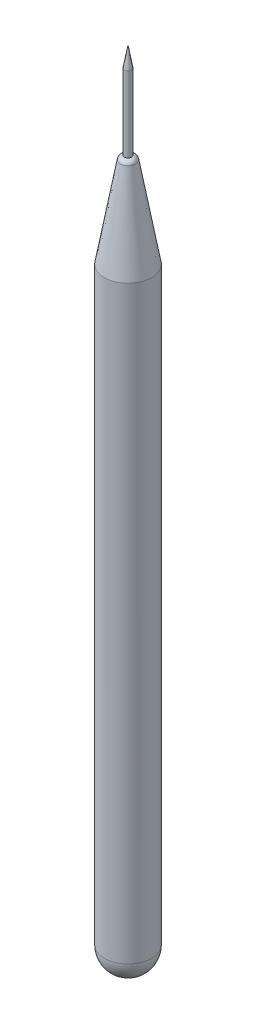
ISO-10303-21;
HEADER;
FILE_DESCRIPTION(('STEP AP214'),'2;1');
FILE_NAME('part.step','',(''),(''),'','','');
FILE_SCHEMA(('AUTOMOTIVE_DESIGN { 1 0 10303 214 1 1 1 1 }'));
ENDSEC;
DATA;
#1=APPLICATION_CONTEXT('core data for automotive mechanical design processes');
#2=APPLICATION_PROTOCOL_DEFINITION('international standard','automotive_design',2000,#1);
#3=PRODUCT_CONTEXT('',#1,'mechanical');
#4=PRODUCT('Part','Part','',(#3));
#5=PRODUCT_RELATED_PRODUCT_CATEGORY('part','',(#4));
#6=PRODUCT_DEFINITION_FORMATION('','',#4);
#7=PRODUCT_DEFINITION_CONTEXT('part definition',#1,'design');
#8=PRODUCT_DEFINITION('design','',#6,#7);
#9=PRODUCT_DEFINITION_SHAPE('','',#8);
#10=(LENGTH_UNIT() NAMED_UNIT(*) SI_UNIT(.MILLI.,.METRE.));
#11=(NAMED_UNIT(*) PLANE_ANGLE_UNIT() SI_UNIT($,.RADIAN.));
#12=(NAMED_UNIT(*) SI_UNIT($,.STERADIAN.) SOLID_ANGLE_UNIT());
#13=UNCERTAINTY_MEASURE_WITH_UNIT(LENGTH_MEASURE(1.E-05),#10,'distance_accuracy_value','');
#14=(GEOMETRIC_REPRESENTATION_CONTEXT(3) GLOBAL_UNCERTAINTY_ASSIGNED_CONTEXT((#13)) GLOBAL_UNIT_ASSIGNED_CONTEXT((#10,
#11,#12)) REPRESENTATION_CONTEXT('',''));
#15=CARTESIAN_POINT('',(0.,0.,0.));
#16=DIRECTION('',(0.,0.,1.));
#17=DIRECTION('',(1.,0.,0.));
#18=AXIS2_PLACEMENT_3D('',#15,#16,#17);
#19=CARTESIAN_POINT('',(0.,75.,0.));
#20=DIRECTION('',(0.,-1.,0.));
#21=DIRECTION('',(0.,0.,-1.));
#22=AXIS2_PLACEMENT_3D('',#19,#20,#21);
#23=CYLINDRICAL_SURFACE('',#22,5.);
#24=CARTESIAN_POINT('',(0.,-70.,0.));
#25=DIRECTION('',(0.,-1.,0.));
#26=DIRECTION('',(0.,0.,-1.));
#27=AXIS2_PLACEMENT_3D('',#24,#25,#26);
#28=CIRCLE('',#27,5.);
#29=CARTESIAN_POINT('',(0.,-70.,-5.));
#30=VERTEX_POINT('',#29);
#31=EDGE_CURVE('E56',#30,#30,#28,.F.);
#32=ORIENTED_EDGE('',*,*,#31,.T.);
#33=EDGE_LOOP('',(#32));
#34=FACE_BOUND('',#33,.T.);
#35=CARTESIAN_POINT('',(0.,54.9999999999997,0.));
#36=DIRECTION('',(0.,1.,0.));
#37=DIRECTION('',(0.,0.,1.));
#38=AXIS2_PLACEMENT_3D('',#35,#36,#37);
#39=CIRCLE('',#38,5.);
#40=CARTESIAN_POINT('',(0.,54.9999999999997,-5.));
#41=VERTEX_POINT('',#40);
#42=EDGE_CURVE('E59',#41,#41,#39,.F.);
#43=ORIENTED_EDGE('',*,*,#42,.T.);
#44=EDGE_LOOP('',(#43));
#45=FACE_BOUND('',#44,.T.);
#46=ADVANCED_FACE('F38',(#34,#45),#23,.T.);
#47=CARTESIAN_POINT('',(0.,75.,0.));
#48=DIRECTION('',(0.,-1.,0.));
#49=DIRECTION('',(0.,0.,-1.));
#50=AXIS2_PLACEMENT_3D('',#47,#48,#49);
#51=CONICAL_SURFACE('',#50,1.47346038583072,0.17453292519943);
#52=CARTESIAN_POINT('',(0.,74.1804982618847,0.));
#53=DIRECTION('',(0.,-1.,0.));
#54=DIRECTION('',(0.,0.,-1.));
#55=AXIS2_PLACEMENT_3D('',#52,#53,#54);
#56=CIRCLE('',#55,1.61796065299792);
#57=CARTESIAN_POINT('',(0.,74.1804982618847,-1.61796065299792));
#58=VERTEX_POINT('',#57);
#59=EDGE_CURVE('E10',#58,#58,#56,.T.);
#60=CARTESIAN_POINT('',(0.,74.1804982618847,-1.61796065299792));
#61=CARTESIAN_POINT('',(0.,73.9807014049901,-1.65319022952919));
#62=CARTESIAN_POINT('',(0.,73.7809045480954,-1.68841980606047));
#63=CARTESIAN_POINT('',(0.,73.3813108343062,-1.75887895912301));
#64=CARTESIAN_POINT('',(0.,73.1815139774115,-1.79410853565428));
#65=CARTESIAN_POINT('',(0.,72.7819202636223,-1.86456768871682));
#66=CARTESIAN_POINT('',(0.,72.5821234067276,-1.8997972652481));
#67=CARTESIAN_POINT('',(0.,72.1825296929384,-1.97025641831064));
#68=CARTESIAN_POINT('',(0.,71.9827328360437,-2.00548599484191));
#69=CARTESIAN_POINT('',(0.,71.5831391222545,-2.07594514790445));
#70=CARTESIAN_POINT('',(0.,71.3833422653598,-2.11117472443573));
#71=CARTESIAN_POINT('',(0.,70.9837485515705,-2.18163387749827));
#72=CARTESIAN_POINT('',(0.,70.7839516946759,-2.21686345402954));
#73=CARTESIAN_POINT('',(0.,70.3843579808866,-2.28732260709208));
#74=CARTESIAN_POINT('',(0.,70.184561123992,-2.32255218362335));
#75=CARTESIAN_POINT('',(0.,69.7849674102027,-2.3930113366859));
#76=CARTESIAN_POINT('',(0.,69.5851705533081,-2.42824091321717));
#77=CARTESIAN_POINT('',(0.,69.1855768395188,-2.49870006627971));
#78=CARTESIAN_POINT('',(0.,68.9857799826242,-2.53392964281099));
#79=CARTESIAN_POINT('',(0.,68.5861862688349,-2.60438879587353));
#80=CARTESIAN_POINT('',(0.,68.3863894119403,-2.6396183724048));
#81=CARTESIAN_POINT('',(0.,67.986795698151,-2.71007752546734));
#82=CARTESIAN_POINT('',(0.,67.7869988412564,-2.74530710199862));
#83=CARTESIAN_POINT('',(0.,67.3874051274671,-2.81576625506116));
#84=CARTESIAN_POINT('',(0.,67.1876082705725,-2.85099583159243));
#85=CARTESIAN_POINT('',(0.,66.7880145567832,-2.92145498465497));
#86=CARTESIAN_POINT('',(0.,66.5882176998886,-2.95668456118625));
#87=CARTESIAN_POINT('',(0.,66.1886239860993,-3.02714371424879));
#88=CARTESIAN_POINT('',(0.,65.9888271292047,-3.06237329078006));
#89=CARTESIAN_POINT('',(0.,65.5892334154154,-3.1328324438426));
#90=CARTESIAN_POINT('',(0.,65.3894365585208,-3.16806202037387));
#91=CARTESIAN_POINT('',(0.,64.9898428447315,-3.23852117343642));
#92=CARTESIAN_POINT('',(0.,64.7900459878368,-3.27375074996769));
#93=CARTESIAN_POINT('',(0.,64.3904522740476,-3.34420990303023));
#94=CARTESIAN_POINT('',(0.,64.190655417153,-3.37943947956151));
#95=CARTESIAN_POINT('',(0.,63.7910617033637,-3.44989863262405));
#96=CARTESIAN_POINT('',(0.,63.591264846469,-3.48512820915532));
#97=CARTESIAN_POINT('',(0.,63.1916711326798,-3.55558736221786));
#98=CARTESIAN_POINT('',(0.,62.9918742757851,-3.59081693874914));
#99=CARTESIAN_POINT('',(0.,62.5922805619958,-3.66127609181168));
#100=CARTESIAN_POINT('',(0.,62.3924837051012,-3.69650566834295));
#101=CARTESIAN_POINT('',(0.,61.992889991312,-3.76696482140549));
#102=CARTESIAN_POINT('',(0.,61.7930931344173,-3.80219439793677));
#103=CARTESIAN_POINT('',(0.,61.393499420628,-3.87265355099931));
#104=CARTESIAN_POINT('',(0.,61.1937025637334,-3.90788312753058));
#105=CARTESIAN_POINT('',(0.,60.7941088499441,-3.97834228059312));
#106=CARTESIAN_POINT('',(0.,60.5943119930495,-4.0135718571244));
#107=CARTESIAN_POINT('',(0.,60.1947182792602,-4.08403101018694));
#108=CARTESIAN_POINT('',(0.,59.9949214223656,-4.11926058671821));
#109=CARTESIAN_POINT('',(0.,59.5953277085763,-4.18971973978075));
#110=CARTESIAN_POINT('',(0.,59.3955308516817,-4.22494931631203));
#111=CARTESIAN_POINT('',(0.,58.9959371378924,-4.29540846937457));
#112=CARTESIAN_POINT('',(0.,58.7961402809978,-4.33063804590584));
#113=CARTESIAN_POINT('',(0.,58.3965465672085,-4.40109719896838));
#114=CARTESIAN_POINT('',(0.,58.1967497103139,-4.43632677549965));
#115=CARTESIAN_POINT('',(0.,57.7971559965246,-4.5067859285622));
#116=CARTESIAN_POINT('',(0.,57.59735913963,-4.54201550509347));
#117=CARTESIAN_POINT('',(0.,57.1977654258407,-4.61247465815601));
#118=CARTESIAN_POINT('',(0.,56.9979685689461,-4.64770423468729));
#119=CARTESIAN_POINT('',(0.,56.5983748551568,-4.71816338774983));
#120=CARTESIAN_POINT('',(0.,56.3985779982622,-4.7533929642811));
#121=CARTESIAN_POINT('',(0.,55.9989842844729,-4.82385211734364));
#122=CARTESIAN_POINT('',(0.,55.7991874275783,-4.85908169387492));
#123=CARTESIAN_POINT('',(0.,55.399593713789,-4.92954084693746));
#124=CARTESIAN_POINT('',(0.,55.1997968568944,-4.96477042346873));
#125=CARTESIAN_POINT('',(0.,54.9999999999997,-5.));
#126=B_SPLINE_CURVE_WITH_KNOTS('',3,(#60,#61,#62,#63,#64,#65,#66,#67,#68,#69,#70,#71,#72,#73,
#74,#75,#76,#77,#78,#79,#80,#81,#82,#83,#84,#85,#86,#87,#88,#89,#90,#91,#92,#93,#94,#95,#96,#97,
#98,#99,#100,#101,#102,#103,#104,#105,#106,#107,#108,#109,#110,#111,#112,#113,#114,#115,#116,
#117,#118,#119,#120,#121,#122,#123,#124,#125),.UNSPECIFIED.,.F.,.F.,(4,2,2,2,2,2,2,2,2,2,2,2,2,
2,2,2,2,2,2,2,2,2,2,2,2,2,2,2,2,2,2,2,4),(0.,0.60863713638581,1.21727427277163,1.82591140915746,
2.43454854554328,3.0431856819291,3.65182281831493,4.26045995470075,4.86909709108656,
5.47773422747238,6.08637136385821,6.69500850024403,7.30364563662985,7.91228277301568,
8.5209199094015,9.12955704578732,9.73819418217313,10.346831318559,10.9554684549448,
11.5641055913306,12.1727427277164,12.7813798641022,13.3900170004881,13.9986541368739,
14.6072912732597,15.2159284096455,15.8245655460314,16.4332026824172,17.041839818803,
17.6504769551888,18.2591140915746,18.8677512279605,19.4763883643463),.UNSPECIFIED.);
#127=EDGE_CURVE('BSEAM76',#58,#41,#126,.T.);
#128=ORIENTED_EDGE('',*,*,#59,.T.);
#129=ORIENTED_EDGE('',*,*,#42,.F.);
#130=ORIENTED_EDGE('',*,*,#127,.T.);
#131=ORIENTED_EDGE('',*,*,#127,.F.);
#132=EDGE_LOOP('',(#128,#130,#129,#131));
#133=FACE_BOUND('',#132,.T.);
#134=ADVANCED_FACE('F76',(#133),#51,.T.);
#135=CARTESIAN_POINT('',(0.,-70.,0.));
#136=DIRECTION('',(0.,1.,0.));
#137=DIRECTION('',(0.,0.,1.));
#138=AXIS2_PLACEMENT_3D('',#135,#136,#137);
#139=SPHERICAL_SURFACE('',#138,5.);
#140=ORIENTED_EDGE('',*,*,#31,.F.);
#141=EDGE_LOOP('',(#140));
#142=FACE_BOUND('',#141,.T.);
#143=ADVANCED_FACE('F82',(#142),#139,.T.);
#144=CARTESIAN_POINT('',(0.,95.,0.));
#145=DIRECTION('',(0.,-1.,0.));
#146=DIRECTION('',(0.,0.,-1.));
#147=AXIS2_PLACEMENT_3D('',#144,#145,#146);
#148=CYLINDRICAL_SURFACE('',#147,0.75);
#149=CARTESIAN_POINT('',(0.,90.9999999999999,0.));
#150=DIRECTION('',(0.,1.,0.));
#151=DIRECTION('',(0.,0.,1.));
#152=AXIS2_PLACEMENT_3D('',#149,#150,#151);
#153=CIRCLE('',#152,0.75);
#154=CARTESIAN_POINT('',(0.,90.9999999999999,-0.749999999999998));
#155=VERTEX_POINT('',#154);
#156=EDGE_CURVE('E45',#155,#155,#153,.F.);
#157=ORIENTED_EDGE('',*,*,#156,.T.);
#158=EDGE_LOOP('',(#157));
#159=FACE_BOUND('',#158,.T.);
#160=CARTESIAN_POINT('',(0.,75.,0.));
#161=DIRECTION('',(0.,1.,0.));
#162=DIRECTION('',(0.,0.,1.));
#163=AXIS2_PLACEMENT_3D('',#160,#161,#162);
#164=CIRCLE('',#163,0.75);
#165=CARTESIAN_POINT('',(0.,75.,0.75));
#166=VERTEX_POINT('',#165);
#167=EDGE_CURVE('E53',#166,#166,#164,.T.);
#168=ORIENTED_EDGE('',*,*,#167,.T.);
#169=EDGE_LOOP('',(#168));
#170=FACE_BOUND('',#169,.T.);
#171=ADVANCED_FACE('F65',(#159,#170),#148,.T.);
#172=CARTESIAN_POINT('',(0.,95.,0.));
#173=DIRECTION('',(0.,1.,0.));
#174=DIRECTION('',(0.,0.,1.));
#175=AXIS2_PLACEMENT_3D('',#172,#173,#174);
#176=PLANE('',#175);
#177=CARTESIAN_POINT('',(0.,95.,0.));
#178=DIRECTION('',(0.,1.,0.));
#179=DIRECTION('',(0.,0.,1.));
#180=AXIS2_PLACEMENT_3D('',#177,#178,#179);
#181=CIRCLE('',#180,0.0446920771661231);
#182=CARTESIAN_POINT('',(0.,95.,-0.0446920771661207));
#183=VERTEX_POINT('',#182);
#184=EDGE_CURVE('E49',#183,#183,#181,.T.);
#185=ORIENTED_EDGE('',*,*,#184,.T.);
#186=EDGE_LOOP('',(#185));
#187=FACE_BOUND('',#186,.T.);
#188=ADVANCED_FACE('F73',(#187),#176,.T.);
#189=CARTESIAN_POINT('',(0.,95.,0.));
#190=DIRECTION('',(0.,-1.,0.));
#191=DIRECTION('',(0.,0.,-1.));
#192=AXIS2_PLACEMENT_3D('',#189,#190,#191);
#193=CONICAL_SURFACE('',#192,0.0446920771661231,0.174532925199431);
#194=CARTESIAN_POINT('',(0.,90.9999999999999,-0.749999999999998));
#195=CARTESIAN_POINT('',(0.,91.0416666666665,-0.742653042470479));
#196=CARTESIAN_POINT('',(0.,91.0833333333332,-0.735306084940959));
#197=CARTESIAN_POINT('',(0.,91.1666666666665,-0.72061216988192));
#198=CARTESIAN_POINT('',(0.,91.2083333333332,-0.7132652123524));
#199=CARTESIAN_POINT('',(0.,91.2916666666665,-0.698571297293361));
#200=CARTESIAN_POINT('',(0.,91.3333333333332,-0.691224339763841));
#201=CARTESIAN_POINT('',(0.,91.4166666666665,-0.676530424704802));
#202=CARTESIAN_POINT('',(0.,91.4583333333332,-0.669183467175283));
#203=CARTESIAN_POINT('',(0.,91.5416666666665,-0.654489552116244));
#204=CARTESIAN_POINT('',(0.,91.5833333333332,-0.647142594586725));
#205=CARTESIAN_POINT('',(0.,91.6666666666665,-0.632448679527685));
#206=CARTESIAN_POINT('',(0.,91.7083333333332,-0.625101721998165));
#207=CARTESIAN_POINT('',(0.,91.7916666666666,-0.610407806939126));
#208=CARTESIAN_POINT('',(0.,91.8333333333332,-0.603060849409607));
#209=CARTESIAN_POINT('',(0.,91.9166666666666,-0.588366934350568));
#210=CARTESIAN_POINT('',(0.,91.9583333333332,-0.581019976821049));
#211=CARTESIAN_POINT('',(0.,92.0416666666666,-0.566326061762009));
#212=CARTESIAN_POINT('',(0.,92.0833333333332,-0.558979104232489));
#213=CARTESIAN_POINT('',(0.,92.1666666666666,-0.54428518917345));
#214=CARTESIAN_POINT('',(0.,92.2083333333332,-0.536938231643931));
#215=CARTESIAN_POINT('',(0.,92.2916666666666,-0.522244316584892));
#216=CARTESIAN_POINT('',(0.,92.3333333333333,-0.514897359055372));
#217=CARTESIAN_POINT('',(0.,92.4166666666666,-0.500203443996333));
#218=CARTESIAN_POINT('',(0.,92.4583333333333,-0.492856486466813));
#219=CARTESIAN_POINT('',(0.,92.5416666666666,-0.478162571407774));
#220=CARTESIAN_POINT('',(0.,92.5833333333333,-0.470815613878255));
#221=CARTESIAN_POINT('',(0.,92.6666666666666,-0.456121698819216));
#222=CARTESIAN_POINT('',(0.,92.7083333333333,-0.448774741289696));
#223=CARTESIAN_POINT('',(0.,92.7916666666666,-0.434080826230657));
#224=CARTESIAN_POINT('',(0.,92.8333333333333,-0.426733868701137));
#225=CARTESIAN_POINT('',(0.,92.9166666666666,-0.412039953642098));
#226=CARTESIAN_POINT('',(0.,92.9583333333333,-0.404692996112579));
#227=CARTESIAN_POINT('',(0.,93.0416666666666,-0.38999908105354));
#228=CARTESIAN_POINT('',(0.,93.0833333333333,-0.38265212352402));
#229=CARTESIAN_POINT('',(0.,93.1666666666666,-0.367958208464981));
#230=CARTESIAN_POINT('',(0.,93.2083333333333,-0.360611250935462));
#231=CARTESIAN_POINT('',(0.,93.2916666666666,-0.345917335876422));
#232=CARTESIAN_POINT('',(0.,93.3333333333333,-0.338570378346902));
#233=CARTESIAN_POINT('',(0.,93.4166666666666,-0.323876463287864));
#234=CARTESIAN_POINT('',(0.,93.4583333333333,-0.316529505758344));
#235=CARTESIAN_POINT('',(0.,93.5416666666666,-0.301835590699306));
#236=CARTESIAN_POINT('',(0.,93.5833333333333,-0.294488633169786));
#237=CARTESIAN_POINT('',(0.,93.6666666666666,-0.279794718110746));
#238=CARTESIAN_POINT('',(0.,93.7083333333333,-0.272447760581226));
#239=CARTESIAN_POINT('',(0.,93.7916666666666,-0.257753845522187));
#240=CARTESIAN_POINT('',(0.,93.8333333333333,-0.250406887992668));
#241=CARTESIAN_POINT('',(0.,93.9166666666666,-0.23571297293363));
#242=CARTESIAN_POINT('',(0.,93.9583333333333,-0.22836601540411));
#243=CARTESIAN_POINT('',(0.,94.0416666666666,-0.21367210034507));
#244=CARTESIAN_POINT('',(0.,94.0833333333333,-0.20632514281555));
#245=CARTESIAN_POINT('',(0.,94.1666666666666,-0.191631227756512));
#246=CARTESIAN_POINT('',(0.,94.2083333333333,-0.184284270226993));
#247=CARTESIAN_POINT('',(0.,94.2916666666666,-0.169590355167954));
#248=CARTESIAN_POINT('',(0.,94.3333333333333,-0.162243397638434));
#249=CARTESIAN_POINT('',(0.,94.4166666666666,-0.147549482579394));
#250=CARTESIAN_POINT('',(0.,94.4583333333333,-0.140202525049874));
#251=CARTESIAN_POINT('',(0.,94.5416666666667,-0.125508609990836));
#252=CARTESIAN_POINT('',(0.,94.5833333333333,-0.118161652461317));
#253=CARTESIAN_POINT('',(0.,94.6666666666667,-0.103467737402278));
#254=CARTESIAN_POINT('',(0.,94.7083333333333,-0.0961207798727577));
#255=CARTESIAN_POINT('',(0.,94.7916666666667,-0.0814268648137183));
#256=CARTESIAN_POINT('',(0.,94.8333333333333,-0.0740799072841988));
#257=CARTESIAN_POINT('',(0.,94.9166666666667,-0.0593859922251599));
#258=CARTESIAN_POINT('',(0.,94.9583333333333,-0.0520390346956404));
#259=CARTESIAN_POINT('',(0.,95.,-0.0446920771661207));
#260=B_SPLINE_CURVE_WITH_KNOTS('',3,(#194,#195,#196,#197,#198,#199,#200,#201,#202,#203,#204,
#205,#206,#207,#208,#209,#210,#211,#212,#213,#214,#215,#216,#217,#218,#219,#220,#221,#222,#223,
#224,#225,#226,#227,#228,#229,#230,#231,#232,#233,#234,#235,#236,#237,#238,#239,#240,#241,#242,
#243,#244,#245,#246,#247,#248,#249,#250,#251,#252,#253,#254,#255,#256,#257,#258,#259),
.UNSPECIFIED.,.F.,.F.,(4,2,2,2,2,2,2,2,2,2,2,2,2,2,2,2,2,2,2,2,2,2,2,2,2,2,2,2,2,2,2,2,4),(0.,
0.126928326485732,0.25385665297145,0.380784979457169,0.507713305942901,0.634641632428619,
0.761569958914337,0.888498285400069,1.01542661188579,1.14235493837151,1.26928326485724,
1.39621159134296,1.52313991782867,1.65006824431441,1.77699657080013,1.90392489728584,
2.03085322377158,2.15778155025729,2.28470987674301,2.41163820322873,2.53856652971446,
2.66549485620018,2.7924231826859,2.91935150917163,3.04627983565735,3.17320816214307,
3.3001364886288,3.42706481511452,3.55399314160024,3.68092146808597,3.80784979457169,
3.9347781210574,4.06170644754312),.UNSPECIFIED.);
#261=EDGE_CURVE('BSEAM68',#155,#183,#260,.T.);
#262=ORIENTED_EDGE('',*,*,#156,.F.);
#263=ORIENTED_EDGE('',*,*,#184,.F.);
#264=ORIENTED_EDGE('',*,*,#261,.T.);
#265=ORIENTED_EDGE('',*,*,#261,.F.);
#266=EDGE_LOOP('',(#262,#264,#263,#265));
#267=FACE_BOUND('',#266,.T.);
#268=ADVANCED_FACE('F68',(#267),#193,.T.);
#269=CARTESIAN_POINT('',(0.,74.0068500842178,0.));
#270=DIRECTION('',(0.,1.,0.));
#271=DIRECTION('',(0.,0.,1.));
#272=AXIS2_PLACEMENT_3D('',#269,#270,#271);
#273=DEGENERATE_TOROIDAL_SURFACE('',#272,0.633152899985718,1.,.T.);
#274=ORIENTED_EDGE('',*,*,#59,.F.);
#275=EDGE_LOOP('',(#274));
#276=FACE_BOUND('',#275,.T.);
#277=ORIENTED_EDGE('',*,*,#167,.F.);
#278=EDGE_LOOP('',(#277));
#279=FACE_BOUND('',#278,.T.);
#280=ADVANCED_FACE('F40',(#276,#279),#273,.T.);
#281=CLOSED_SHELL('',(#46,#134,#143,#171,#188,#268,#280));
#282=MANIFOLD_SOLID_BREP('B2',#281);
#283=ADVANCED_BREP_SHAPE_REPRESENTATION('',(#18,#282),#14);
#284=SHAPE_DEFINITION_REPRESENTATION(#9,#283);
ENDSEC;
END-ISO-10303-21;
